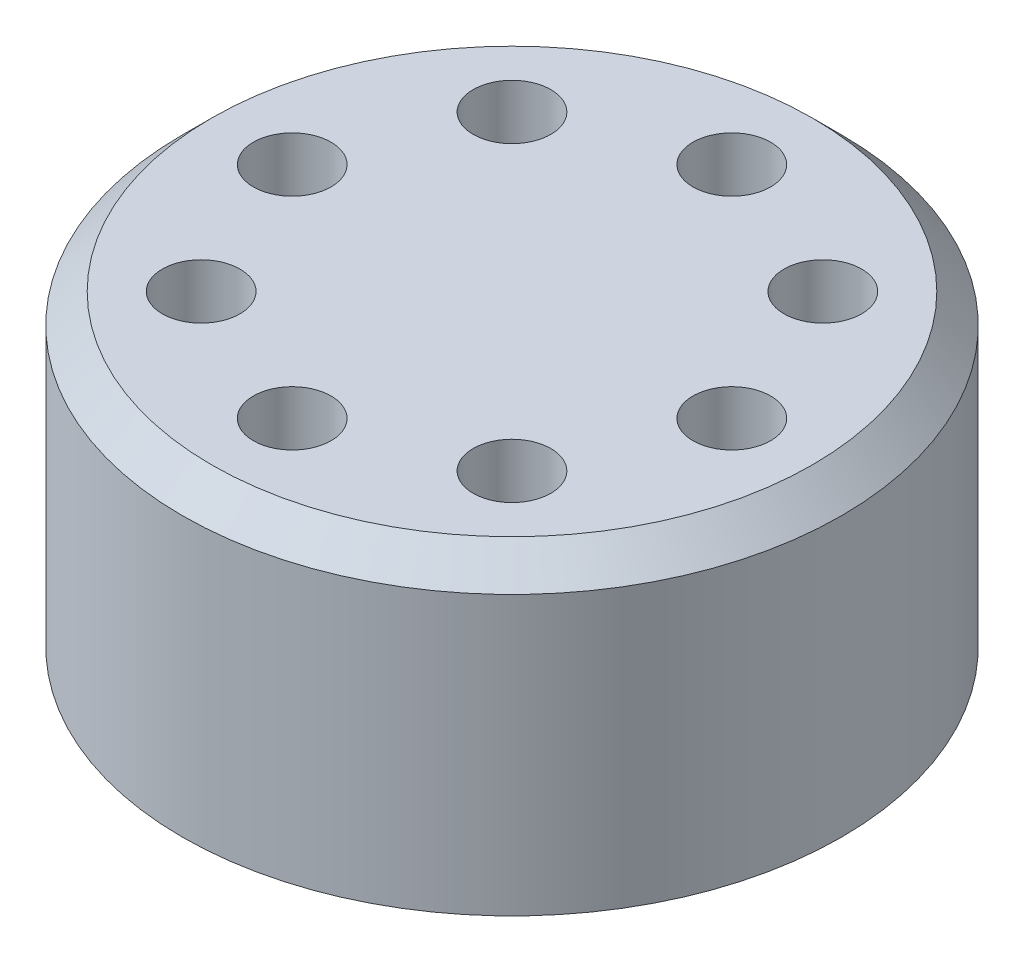
ISO-10303-21;
HEADER;
FILE_DESCRIPTION(('STEP AP214'),'2;1');
FILE_NAME('part.step','',(''),(''),'','','');
FILE_SCHEMA(('AUTOMOTIVE_DESIGN { 1 0 10303 214 1 1 1 1 }'));
ENDSEC;
DATA;
#1=APPLICATION_CONTEXT('core data for automotive mechanical design processes');
#2=APPLICATION_PROTOCOL_DEFINITION('international standard','automotive_design',2000,#1);
#3=PRODUCT_CONTEXT('',#1,'mechanical');
#4=PRODUCT('Part','Part','',(#3));
#5=PRODUCT_RELATED_PRODUCT_CATEGORY('part','',(#4));
#6=PRODUCT_DEFINITION_FORMATION('','',#4);
#7=PRODUCT_DEFINITION_CONTEXT('part definition',#1,'design');
#8=PRODUCT_DEFINITION('design','',#6,#7);
#9=PRODUCT_DEFINITION_SHAPE('','',#8);
#10=(LENGTH_UNIT() NAMED_UNIT(*) SI_UNIT(.MILLI.,.METRE.));
#11=(NAMED_UNIT(*) PLANE_ANGLE_UNIT() SI_UNIT($,.RADIAN.));
#12=(NAMED_UNIT(*) SI_UNIT($,.STERADIAN.) SOLID_ANGLE_UNIT());
#13=UNCERTAINTY_MEASURE_WITH_UNIT(LENGTH_MEASURE(1.E-05),#10,'distance_accuracy_value','');
#14=(GEOMETRIC_REPRESENTATION_CONTEXT(3) GLOBAL_UNCERTAINTY_ASSIGNED_CONTEXT((#13)) GLOBAL_UNIT_ASSIGNED_CONTEXT((#10,
#11,#12)) REPRESENTATION_CONTEXT('',''));
#15=CARTESIAN_POINT('',(0.,0.,0.));
#16=DIRECTION('',(0.,0.,1.));
#17=DIRECTION('',(1.,0.,0.));
#18=AXIS2_PLACEMENT_3D('',#15,#16,#17);
#19=CARTESIAN_POINT('',(0.,21.,0.));
#20=DIRECTION('',(0.,-1.,0.));
#21=DIRECTION('',(0.,0.,-1.));
#22=AXIS2_PLACEMENT_3D('',#19,#20,#21);
#23=CYLINDRICAL_SURFACE('',#22,22.5);
#24=CARTESIAN_POINT('',(0.,19.,0.));
#25=DIRECTION('',(0.,1.,0.));
#26=DIRECTION('',(0.,0.,1.));
#27=AXIS2_PLACEMENT_3D('',#24,#25,#26);
#28=CIRCLE('',#27,22.5);
#29=CARTESIAN_POINT('',(0.,19.,-22.5));
#30=VERTEX_POINT('',#29);
#31=EDGE_CURVE('E10',#30,#30,#28,.F.);
#32=CARTESIAN_POINT('',(0.,0.,0.));
#33=DIRECTION('',(0.,1.,0.));
#34=DIRECTION('',(0.,0.,1.));
#35=AXIS2_PLACEMENT_3D('',#32,#33,#34);
#36=CIRCLE('',#35,22.5);
#37=CARTESIAN_POINT('',(0.,0.,-22.5));
#38=VERTEX_POINT('',#37);
#39=EDGE_CURVE('E50',#38,#38,#36,.T.);
#40=CARTESIAN_POINT('',(0.,19.,-22.5));
#41=CARTESIAN_POINT('',(0.,18.8020833333334,-22.5));
#42=CARTESIAN_POINT('',(0.,18.6041666666667,-22.5));
#43=CARTESIAN_POINT('',(0.,18.2083333333334,-22.5));
#44=CARTESIAN_POINT('',(0.,18.0104166666667,-22.5));
#45=CARTESIAN_POINT('',(0.,17.6145833333334,-22.5));
#46=CARTESIAN_POINT('',(0.,17.4166666666667,-22.5));
#47=CARTESIAN_POINT('',(0.,17.0208333333334,-22.5));
#48=CARTESIAN_POINT('',(0.,16.8229166666667,-22.5));
#49=CARTESIAN_POINT('',(0.,16.4270833333334,-22.5));
#50=CARTESIAN_POINT('',(0.,16.2291666666667,-22.5));
#51=CARTESIAN_POINT('',(0.,15.8333333333334,-22.5));
#52=CARTESIAN_POINT('',(0.,15.6354166666667,-22.5));
#53=CARTESIAN_POINT('',(0.,15.2395833333333,-22.5));
#54=CARTESIAN_POINT('',(0.,15.0416666666667,-22.5));
#55=CARTESIAN_POINT('',(0.,14.6458333333333,-22.5));
#56=CARTESIAN_POINT('',(0.,14.4479166666667,-22.5));
#57=CARTESIAN_POINT('',(0.,14.0520833333333,-22.5));
#58=CARTESIAN_POINT('',(0.,13.8541666666667,-22.5));
#59=CARTESIAN_POINT('',(0.,13.4583333333333,-22.5));
#60=CARTESIAN_POINT('',(0.,13.2604166666667,-22.5));
#61=CARTESIAN_POINT('',(0.,12.8645833333333,-22.5));
#62=CARTESIAN_POINT('',(0.,12.6666666666667,-22.5));
#63=CARTESIAN_POINT('',(0.,12.2708333333333,-22.5));
#64=CARTESIAN_POINT('',(0.,12.0729166666667,-22.5));
#65=CARTESIAN_POINT('',(0.,11.6770833333333,-22.5));
#66=CARTESIAN_POINT('',(0.,11.4791666666667,-22.5));
#67=CARTESIAN_POINT('',(0.,11.0833333333333,-22.5));
#68=CARTESIAN_POINT('',(0.,10.8854166666667,-22.5));
#69=CARTESIAN_POINT('',(0.,10.4895833333333,-22.5));
#70=CARTESIAN_POINT('',(0.,10.2916666666667,-22.5));
#71=CARTESIAN_POINT('',(0.,9.89583333333334,-22.5));
#72=CARTESIAN_POINT('',(0.,9.69791666666668,-22.5));
#73=CARTESIAN_POINT('',(0.,9.30208333333334,-22.5));
#74=CARTESIAN_POINT('',(0.,9.10416666666668,-22.5));
#75=CARTESIAN_POINT('',(0.,8.70833333333334,-22.5));
#76=CARTESIAN_POINT('',(0.,8.51041666666668,-22.5));
#77=CARTESIAN_POINT('',(0.,8.11458333333334,-22.5));
#78=CARTESIAN_POINT('',(0.,7.91666666666668,-22.5));
#79=CARTESIAN_POINT('',(0.,7.52083333333334,-22.5));
#80=CARTESIAN_POINT('',(0.,7.32291666666667,-22.5));
#81=CARTESIAN_POINT('',(0.,6.92708333333334,-22.5));
#82=CARTESIAN_POINT('',(0.,6.72916666666667,-22.5));
#83=CARTESIAN_POINT('',(0.,6.33333333333334,-22.5));
#84=CARTESIAN_POINT('',(0.,6.13541666666667,-22.5));
#85=CARTESIAN_POINT('',(0.,5.73958333333334,-22.5));
#86=CARTESIAN_POINT('',(0.,5.54166666666667,-22.5));
#87=CARTESIAN_POINT('',(0.,5.14583333333334,-22.5));
#88=CARTESIAN_POINT('',(0.,4.94791666666667,-22.5));
#89=CARTESIAN_POINT('',(0.,4.55208333333334,-22.5));
#90=CARTESIAN_POINT('',(0.,4.35416666666667,-22.5));
#91=CARTESIAN_POINT('',(0.,3.95833333333334,-22.5));
#92=CARTESIAN_POINT('',(0.,3.76041666666667,-22.5));
#93=CARTESIAN_POINT('',(0.,3.36458333333334,-22.5));
#94=CARTESIAN_POINT('',(0.,3.16666666666667,-22.5));
#95=CARTESIAN_POINT('',(0.,2.77083333333334,-22.5));
#96=CARTESIAN_POINT('',(0.,2.57291666666667,-22.5));
#97=CARTESIAN_POINT('',(0.,2.17708333333334,-22.5));
#98=CARTESIAN_POINT('',(0.,1.97916666666667,-22.5));
#99=CARTESIAN_POINT('',(0.,1.58333333333333,-22.5));
#100=CARTESIAN_POINT('',(0.,1.38541666666667,-22.5));
#101=CARTESIAN_POINT('',(0.,0.989583333333334,-22.5));
#102=CARTESIAN_POINT('',(0.,0.791666666666667,-22.5));
#103=CARTESIAN_POINT('',(0.,0.395833333333334,-22.5));
#104=CARTESIAN_POINT('',(0.,0.197916666666667,-22.5));
#105=CARTESIAN_POINT('',(0.,0.,-22.5));
#106=B_SPLINE_CURVE_WITH_KNOTS('',3,(#40,#41,#42,#43,#44,#45,#46,#47,#48,#49,#50,#51,#52,#53,
#54,#55,#56,#57,#58,#59,#60,#61,#62,#63,#64,#65,#66,#67,#68,#69,#70,#71,#72,#73,#74,#75,#76,#77,
#78,#79,#80,#81,#82,#83,#84,#85,#86,#87,#88,#89,#90,#91,#92,#93,#94,#95,#96,#97,#98,#99,#100,
#101,#102,#103,#104,#105),.UNSPECIFIED.,.F.,.F.,(4,2,2,2,2,2,2,2,2,2,2,2,2,2,2,2,2,2,2,2,2,2,2,
2,2,2,2,2,2,2,2,2,4),(0.,0.593750000000001,1.1875,1.78125,2.375,2.96875,3.5625,4.15625,4.75,
5.34375,5.9375,6.53125000000001,7.12500000000001,7.71875000000001,8.31250000000001,
8.90625000000001,9.50000000000001,10.09375,10.6875,11.28125,11.875,12.46875,13.0625,13.65625,
14.25,14.84375,15.4375,16.03125,16.625,17.21875,17.8125,18.40625,19.),.UNSPECIFIED.);
#107=EDGE_CURVE('BSEAM38',#30,#38,#106,.T.);
#108=ORIENTED_EDGE('',*,*,#31,.T.);
#109=ORIENTED_EDGE('',*,*,#39,.T.);
#110=ORIENTED_EDGE('',*,*,#107,.T.);
#111=ORIENTED_EDGE('',*,*,#107,.F.);
#112=EDGE_LOOP('',(#108,#110,#109,#111));
#113=FACE_BOUND('',#112,.T.);
#114=ADVANCED_FACE('F38',(#113),#23,.T.);
#115=CARTESIAN_POINT('',(0.,21.,0.));
#116=DIRECTION('',(0.,1.,0.));
#117=DIRECTION('',(0.,0.,1.));
#118=AXIS2_PLACEMENT_3D('',#115,#116,#117);
#119=PLANE('',#118);
#120=CARTESIAN_POINT('',(0.,21.,-15.));
#121=DIRECTION('',(0.,1.,0.));
#122=DIRECTION('',(0.,0.,1.));
#123=AXIS2_PLACEMENT_3D('',#120,#121,#122);
#124=CIRCLE('',#123,2.65);
#125=CARTESIAN_POINT('',(0.,21.,-12.35));
#126=VERTEX_POINT('',#125);
#127=EDGE_CURVE('E101',#126,#126,#124,.T.);
#128=ORIENTED_EDGE('',*,*,#127,.F.);
#129=EDGE_LOOP('',(#128));
#130=FACE_BOUND('',#129,.T.);
#131=CARTESIAN_POINT('',(15.,21.,0.));
#132=DIRECTION('',(0.,1.,0.));
#133=DIRECTION('',(0.,0.,1.));
#134=AXIS2_PLACEMENT_3D('',#131,#132,#133);
#135=CIRCLE('',#134,2.65);
#136=CARTESIAN_POINT('',(15.,21.,2.65));
#137=VERTEX_POINT('',#136);
#138=EDGE_CURVE('E95',#137,#137,#135,.T.);
#139=ORIENTED_EDGE('',*,*,#138,.F.);
#140=EDGE_LOOP('',(#139));
#141=FACE_BOUND('',#140,.T.);
#142=CARTESIAN_POINT('',(0.,21.,15.));
#143=DIRECTION('',(0.,1.,0.));
#144=DIRECTION('',(0.,0.,1.));
#145=AXIS2_PLACEMENT_3D('',#142,#143,#144);
#146=CIRCLE('',#145,2.65);
#147=CARTESIAN_POINT('',(0.,21.,17.65));
#148=VERTEX_POINT('',#147);
#149=EDGE_CURVE('E89',#148,#148,#146,.T.);
#150=ORIENTED_EDGE('',*,*,#149,.F.);
#151=EDGE_LOOP('',(#150));
#152=FACE_BOUND('',#151,.T.);
#153=CARTESIAN_POINT('',(-15.,21.,0.));
#154=DIRECTION('',(0.,1.,0.));
#155=DIRECTION('',(0.,0.,1.));
#156=AXIS2_PLACEMENT_3D('',#153,#154,#155);
#157=CIRCLE('',#156,2.65);
#158=CARTESIAN_POINT('',(-15.,21.,2.65));
#159=VERTEX_POINT('',#158);
#160=EDGE_CURVE('E83',#159,#159,#157,.T.);
#161=ORIENTED_EDGE('',*,*,#160,.F.);
#162=EDGE_LOOP('',(#161));
#163=FACE_BOUND('',#162,.T.);
#164=CARTESIAN_POINT('',(10.6066017177982,21.,-10.6066017177982));
#165=DIRECTION('',(0.,1.,0.));
#166=DIRECTION('',(0.,0.,1.));
#167=AXIS2_PLACEMENT_3D('',#164,#165,#166);
#168=CIRCLE('',#167,2.65);
#169=CARTESIAN_POINT('',(10.6066017177982,21.,-7.95660171779821));
#170=VERTEX_POINT('',#169);
#171=EDGE_CURVE('E77',#170,#170,#168,.T.);
#172=ORIENTED_EDGE('',*,*,#171,.F.);
#173=EDGE_LOOP('',(#172));
#174=FACE_BOUND('',#173,.T.);
#175=CARTESIAN_POINT('',(10.6066017177982,21.,10.6066017177982));
#176=DIRECTION('',(0.,1.,0.));
#177=DIRECTION('',(0.,0.,1.));
#178=AXIS2_PLACEMENT_3D('',#175,#176,#177);
#179=CIRCLE('',#178,2.65);
#180=CARTESIAN_POINT('',(10.6066017177982,21.,13.2566017177982));
#181=VERTEX_POINT('',#180);
#182=EDGE_CURVE('E71',#181,#181,#179,.T.);
#183=ORIENTED_EDGE('',*,*,#182,.F.);
#184=EDGE_LOOP('',(#183));
#185=FACE_BOUND('',#184,.T.);
#186=CARTESIAN_POINT('',(-10.6066017177982,21.,10.6066017177982));
#187=DIRECTION('',(0.,1.,0.));
#188=DIRECTION('',(0.,0.,1.));
#189=AXIS2_PLACEMENT_3D('',#186,#187,#188);
#190=CIRCLE('',#189,2.65);
#191=CARTESIAN_POINT('',(-10.6066017177982,21.,13.2566017177982));
#192=VERTEX_POINT('',#191);
#193=EDGE_CURVE('E65',#192,#192,#190,.T.);
#194=ORIENTED_EDGE('',*,*,#193,.F.);
#195=EDGE_LOOP('',(#194));
#196=FACE_BOUND('',#195,.T.);
#197=CARTESIAN_POINT('',(-10.6066017177982,21.,-10.6066017177982));
#198=DIRECTION('',(0.,1.,0.));
#199=DIRECTION('',(0.,0.,1.));
#200=AXIS2_PLACEMENT_3D('',#197,#198,#199);
#201=CIRCLE('',#200,2.65);
#202=CARTESIAN_POINT('',(-10.6066017177982,21.,-7.95660171779822));
#203=VERTEX_POINT('',#202);
#204=EDGE_CURVE('E59',#203,#203,#201,.T.);
#205=ORIENTED_EDGE('',*,*,#204,.F.);
#206=EDGE_LOOP('',(#205));
#207=FACE_BOUND('',#206,.T.);
#208=CARTESIAN_POINT('',(0.,21.,0.));
#209=DIRECTION('',(0.,1.,0.));
#210=DIRECTION('',(0.,0.,1.));
#211=AXIS2_PLACEMENT_3D('',#208,#209,#210);
#212=CIRCLE('',#211,20.5);
#213=CARTESIAN_POINT('',(0.,21.,20.5));
#214=VERTEX_POINT('',#213);
#215=EDGE_CURVE('E46',#214,#214,#212,.T.);
#216=ORIENTED_EDGE('',*,*,#215,.T.);
#217=EDGE_LOOP('',(#216));
#218=FACE_BOUND('',#217,.T.);
#219=ADVANCED_FACE('F107',(#130,#141,#152,#163,#174,#185,#196,#207,#218),#119,.T.);
#220=CARTESIAN_POINT('',(0.,0.,0.));
#221=DIRECTION('',(0.,1.,0.));
#222=DIRECTION('',(0.,0.,1.));
#223=AXIS2_PLACEMENT_3D('',#220,#221,#222);
#224=PLANE('',#223);
#225=CARTESIAN_POINT('',(0.,0.,-15.));
#226=DIRECTION('',(0.,1.,0.));
#227=DIRECTION('',(0.,0.,1.));
#228=AXIS2_PLACEMENT_3D('',#225,#226,#227);
#229=CIRCLE('',#228,2.65);
#230=CARTESIAN_POINT('',(0.,0.,-12.35));
#231=VERTEX_POINT('',#230);
#232=EDGE_CURVE('E98',#231,#231,#229,.T.);
#233=ORIENTED_EDGE('',*,*,#232,.T.);
#234=EDGE_LOOP('',(#233));
#235=FACE_BOUND('',#234,.T.);
#236=CARTESIAN_POINT('',(15.,0.,0.));
#237=DIRECTION('',(0.,1.,0.));
#238=DIRECTION('',(0.,0.,1.));
#239=AXIS2_PLACEMENT_3D('',#236,#237,#238);
#240=CIRCLE('',#239,2.65);
#241=CARTESIAN_POINT('',(15.,0.,2.65));
#242=VERTEX_POINT('',#241);
#243=EDGE_CURVE('E92',#242,#242,#240,.T.);
#244=ORIENTED_EDGE('',*,*,#243,.T.);
#245=EDGE_LOOP('',(#244));
#246=FACE_BOUND('',#245,.T.);
#247=CARTESIAN_POINT('',(0.,0.,15.));
#248=DIRECTION('',(0.,1.,0.));
#249=DIRECTION('',(0.,0.,1.));
#250=AXIS2_PLACEMENT_3D('',#247,#248,#249);
#251=CIRCLE('',#250,2.65);
#252=CARTESIAN_POINT('',(0.,0.,17.65));
#253=VERTEX_POINT('',#252);
#254=EDGE_CURVE('E86',#253,#253,#251,.T.);
#255=ORIENTED_EDGE('',*,*,#254,.T.);
#256=EDGE_LOOP('',(#255));
#257=FACE_BOUND('',#256,.T.);
#258=CARTESIAN_POINT('',(-15.,0.,0.));
#259=DIRECTION('',(0.,1.,0.));
#260=DIRECTION('',(0.,0.,1.));
#261=AXIS2_PLACEMENT_3D('',#258,#259,#260);
#262=CIRCLE('',#261,2.65);
#263=CARTESIAN_POINT('',(-15.,0.,2.65));
#264=VERTEX_POINT('',#263);
#265=EDGE_CURVE('E80',#264,#264,#262,.T.);
#266=ORIENTED_EDGE('',*,*,#265,.T.);
#267=EDGE_LOOP('',(#266));
#268=FACE_BOUND('',#267,.T.);
#269=CARTESIAN_POINT('',(10.6066017177982,0.,-10.6066017177982));
#270=DIRECTION('',(0.,1.,0.));
#271=DIRECTION('',(0.,0.,1.));
#272=AXIS2_PLACEMENT_3D('',#269,#270,#271);
#273=CIRCLE('',#272,2.65);
#274=CARTESIAN_POINT('',(10.6066017177982,0.,-7.95660171779822));
#275=VERTEX_POINT('',#274);
#276=EDGE_CURVE('E74',#275,#275,#273,.T.);
#277=ORIENTED_EDGE('',*,*,#276,.T.);
#278=EDGE_LOOP('',(#277));
#279=FACE_BOUND('',#278,.T.);
#280=CARTESIAN_POINT('',(10.6066017177982,0.,10.6066017177982));
#281=DIRECTION('',(0.,1.,0.));
#282=DIRECTION('',(0.,0.,1.));
#283=AXIS2_PLACEMENT_3D('',#280,#281,#282);
#284=CIRCLE('',#283,2.65);
#285=CARTESIAN_POINT('',(10.6066017177982,0.,13.2566017177982));
#286=VERTEX_POINT('',#285);
#287=EDGE_CURVE('E68',#286,#286,#284,.T.);
#288=ORIENTED_EDGE('',*,*,#287,.T.);
#289=EDGE_LOOP('',(#288));
#290=FACE_BOUND('',#289,.T.);
#291=CARTESIAN_POINT('',(-10.6066017177982,0.,10.6066017177982));
#292=DIRECTION('',(0.,1.,0.));
#293=DIRECTION('',(0.,0.,1.));
#294=AXIS2_PLACEMENT_3D('',#291,#292,#293);
#295=CIRCLE('',#294,2.65);
#296=CARTESIAN_POINT('',(-10.6066017177982,0.,13.2566017177982));
#297=VERTEX_POINT('',#296);
#298=EDGE_CURVE('E62',#297,#297,#295,.T.);
#299=ORIENTED_EDGE('',*,*,#298,.T.);
#300=EDGE_LOOP('',(#299));
#301=FACE_BOUND('',#300,.T.);
#302=CARTESIAN_POINT('',(-10.6066017177982,0.,-10.6066017177982));
#303=DIRECTION('',(0.,1.,0.));
#304=DIRECTION('',(0.,0.,1.));
#305=AXIS2_PLACEMENT_3D('',#302,#303,#304);
#306=CIRCLE('',#305,2.65);
#307=CARTESIAN_POINT('',(-10.6066017177982,0.,-7.95660171779822));
#308=VERTEX_POINT('',#307);
#309=EDGE_CURVE('E54',#308,#308,#306,.T.);
#310=ORIENTED_EDGE('',*,*,#309,.T.);
#311=EDGE_LOOP('',(#310));
#312=FACE_BOUND('',#311,.T.);
#313=ORIENTED_EDGE('',*,*,#39,.F.);
#314=EDGE_LOOP('',(#313));
#315=FACE_BOUND('',#314,.T.);
#316=ADVANCED_FACE('F110',(#235,#246,#257,#268,#279,#290,#301,#312,#315),#224,.F.);
#317=CARTESIAN_POINT('',(0.,21.,0.));
#318=DIRECTION('',(0.,-1.,0.));
#319=DIRECTION('',(0.,0.,-1.));
#320=AXIS2_PLACEMENT_3D('',#317,#318,#319);
#321=CONICAL_SURFACE('',#320,20.5,0.785398163397447);
#322=ORIENTED_EDGE('',*,*,#31,.F.);
#323=EDGE_LOOP('',(#322));
#324=FACE_BOUND('',#323,.T.);
#325=ORIENTED_EDGE('',*,*,#215,.F.);
#326=EDGE_LOOP('',(#325));
#327=FACE_BOUND('',#326,.T.);
#328=ADVANCED_FACE('F41',(#324,#327),#321,.T.);
#329=CARTESIAN_POINT('',(-10.6066017177982,21.,-10.6066017177982));
#330=DIRECTION('',(0.,1.,0.));
#331=DIRECTION('',(0.,0.,1.));
#332=AXIS2_PLACEMENT_3D('',#329,#330,#331);
#333=CYLINDRICAL_SURFACE('',#332,2.65);
#334=ORIENTED_EDGE('',*,*,#309,.F.);
#335=EDGE_LOOP('',(#334));
#336=FACE_BOUND('',#335,.T.);
#337=ORIENTED_EDGE('',*,*,#204,.T.);
#338=EDGE_LOOP('',(#337));
#339=FACE_BOUND('',#338,.T.);
#340=ADVANCED_FACE('F126',(#336,#339),#333,.F.);
#341=CARTESIAN_POINT('',(-10.6066017177982,21.,10.6066017177982));
#342=DIRECTION('',(0.,1.,0.));
#343=DIRECTION('',(0.,0.,1.));
#344=AXIS2_PLACEMENT_3D('',#341,#342,#343);
#345=CYLINDRICAL_SURFACE('',#344,2.65);
#346=ORIENTED_EDGE('',*,*,#298,.F.);
#347=EDGE_LOOP('',(#346));
#348=FACE_BOUND('',#347,.T.);
#349=ORIENTED_EDGE('',*,*,#193,.T.);
#350=EDGE_LOOP('',(#349));
#351=FACE_BOUND('',#350,.T.);
#352=ADVANCED_FACE('F128',(#348,#351),#345,.F.);
#353=CARTESIAN_POINT('',(10.6066017177982,21.,10.6066017177982));
#354=DIRECTION('',(0.,1.,0.));
#355=DIRECTION('',(0.,0.,1.));
#356=AXIS2_PLACEMENT_3D('',#353,#354,#355);
#357=CYLINDRICAL_SURFACE('',#356,2.65);
#358=ORIENTED_EDGE('',*,*,#287,.F.);
#359=EDGE_LOOP('',(#358));
#360=FACE_BOUND('',#359,.T.);
#361=ORIENTED_EDGE('',*,*,#182,.T.);
#362=EDGE_LOOP('',(#361));
#363=FACE_BOUND('',#362,.T.);
#364=ADVANCED_FACE('F135',(#360,#363),#357,.F.);
#365=CARTESIAN_POINT('',(10.6066017177982,21.,-10.6066017177982));
#366=DIRECTION('',(0.,1.,0.));
#367=DIRECTION('',(0.,0.,1.));
#368=AXIS2_PLACEMENT_3D('',#365,#366,#367);
#369=CYLINDRICAL_SURFACE('',#368,2.65);
#370=ORIENTED_EDGE('',*,*,#276,.F.);
#371=EDGE_LOOP('',(#370));
#372=FACE_BOUND('',#371,.T.);
#373=ORIENTED_EDGE('',*,*,#171,.T.);
#374=EDGE_LOOP('',(#373));
#375=FACE_BOUND('',#374,.T.);
#376=ADVANCED_FACE('F169',(#372,#375),#369,.F.);
#377=CARTESIAN_POINT('',(-15.,21.,0.));
#378=DIRECTION('',(0.,1.,0.));
#379=DIRECTION('',(0.,0.,1.));
#380=AXIS2_PLACEMENT_3D('',#377,#378,#379);
#381=CYLINDRICAL_SURFACE('',#380,2.65);
#382=ORIENTED_EDGE('',*,*,#265,.F.);
#383=EDGE_LOOP('',(#382));
#384=FACE_BOUND('',#383,.T.);
#385=ORIENTED_EDGE('',*,*,#160,.T.);
#386=EDGE_LOOP('',(#385));
#387=FACE_BOUND('',#386,.T.);
#388=ADVANCED_FACE('F174',(#384,#387),#381,.F.);
#389=CARTESIAN_POINT('',(0.,21.,15.));
#390=DIRECTION('',(0.,1.,0.));
#391=DIRECTION('',(0.,0.,1.));
#392=AXIS2_PLACEMENT_3D('',#389,#390,#391);
#393=CYLINDRICAL_SURFACE('',#392,2.65);
#394=ORIENTED_EDGE('',*,*,#254,.F.);
#395=EDGE_LOOP('',(#394));
#396=FACE_BOUND('',#395,.T.);
#397=ORIENTED_EDGE('',*,*,#149,.T.);
#398=EDGE_LOOP('',(#397));
#399=FACE_BOUND('',#398,.T.);
#400=ADVANCED_FACE('F180',(#396,#399),#393,.F.);
#401=CARTESIAN_POINT('',(15.,21.,0.));
#402=DIRECTION('',(0.,1.,0.));
#403=DIRECTION('',(0.,0.,1.));
#404=AXIS2_PLACEMENT_3D('',#401,#402,#403);
#405=CYLINDRICAL_SURFACE('',#404,2.65);
#406=ORIENTED_EDGE('',*,*,#243,.F.);
#407=EDGE_LOOP('',(#406));
#408=FACE_BOUND('',#407,.T.);
#409=ORIENTED_EDGE('',*,*,#138,.T.);
#410=EDGE_LOOP('',(#409));
#411=FACE_BOUND('',#410,.T.);
#412=ADVANCED_FACE('F184',(#408,#411),#405,.F.);
#413=CARTESIAN_POINT('',(0.,21.,-15.));
#414=DIRECTION('',(0.,1.,0.));
#415=DIRECTION('',(0.,0.,1.));
#416=AXIS2_PLACEMENT_3D('',#413,#414,#415);
#417=CYLINDRICAL_SURFACE('',#416,2.65);
#418=ORIENTED_EDGE('',*,*,#232,.F.);
#419=EDGE_LOOP('',(#418));
#420=FACE_BOUND('',#419,.T.);
#421=ORIENTED_EDGE('',*,*,#127,.T.);
#422=EDGE_LOOP('',(#421));
#423=FACE_BOUND('',#422,.T.);
#424=ADVANCED_FACE('F105',(#420,#423),#417,.F.);
#425=CLOSED_SHELL('',(#114,#219,#316,#328,#340,#352,#364,#376,#388,#400,#412,#424));
#426=MANIFOLD_SOLID_BREP('B2',#425);
#427=ADVANCED_BREP_SHAPE_REPRESENTATION('',(#18,#426),#14);
#428=SHAPE_DEFINITION_REPRESENTATION(#9,#427);
ENDSEC;
END-ISO-10303-21;
